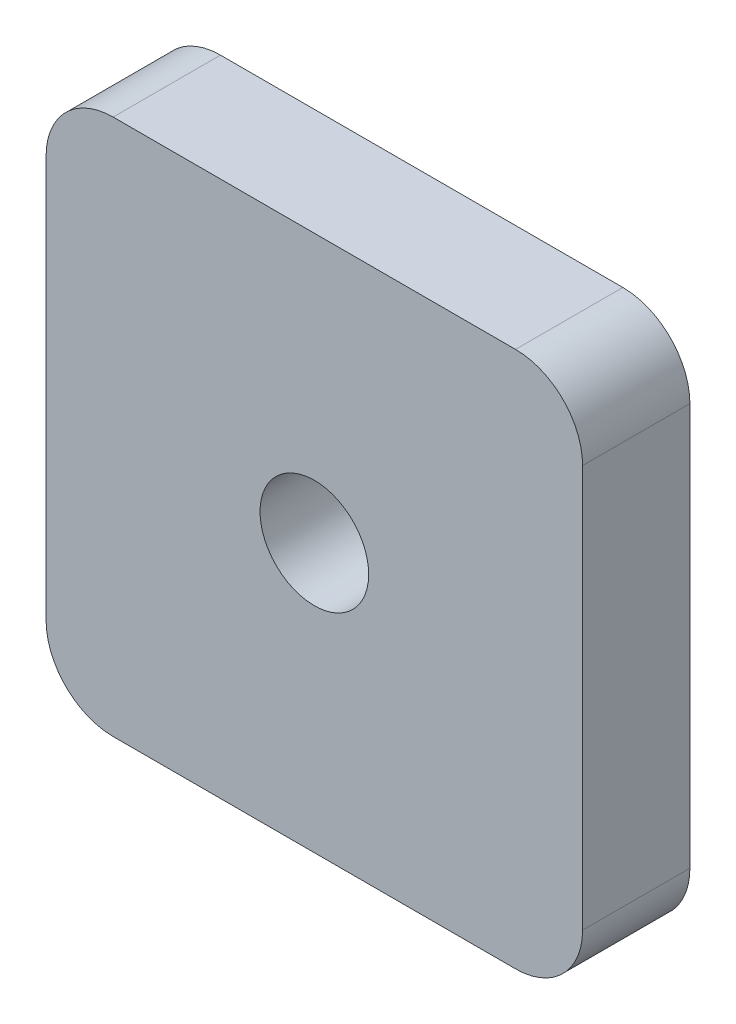
ISO-10303-21;
HEADER;
FILE_DESCRIPTION(('STEP AP214'),'2;1');
FILE_NAME('part.step','',(''),(''),'','','');
FILE_SCHEMA(('AUTOMOTIVE_DESIGN { 1 0 10303 214 1 1 1 1 }'));
ENDSEC;
DATA;
#1=APPLICATION_CONTEXT('core data for automotive mechanical design processes');
#2=APPLICATION_PROTOCOL_DEFINITION('international standard','automotive_design',2000,#1);
#3=PRODUCT_CONTEXT('',#1,'mechanical');
#4=PRODUCT('Part','Part','',(#3));
#5=PRODUCT_RELATED_PRODUCT_CATEGORY('part','',(#4));
#6=PRODUCT_DEFINITION_FORMATION('','',#4);
#7=PRODUCT_DEFINITION_CONTEXT('part definition',#1,'design');
#8=PRODUCT_DEFINITION('design','',#6,#7);
#9=PRODUCT_DEFINITION_SHAPE('','',#8);
#10=(LENGTH_UNIT() NAMED_UNIT(*) SI_UNIT(.MILLI.,.METRE.));
#11=(NAMED_UNIT(*) PLANE_ANGLE_UNIT() SI_UNIT($,.RADIAN.));
#12=(NAMED_UNIT(*) SI_UNIT($,.STERADIAN.) SOLID_ANGLE_UNIT());
#13=UNCERTAINTY_MEASURE_WITH_UNIT(LENGTH_MEASURE(1.E-05),#10,'distance_accuracy_value','');
#14=(GEOMETRIC_REPRESENTATION_CONTEXT(3) GLOBAL_UNCERTAINTY_ASSIGNED_CONTEXT((#13)) GLOBAL_UNIT_ASSIGNED_CONTEXT((#10,
#11,#12)) REPRESENTATION_CONTEXT('',''));
#15=CARTESIAN_POINT('',(0.,0.,0.));
#16=DIRECTION('',(0.,0.,1.));
#17=DIRECTION('',(1.,0.,0.));
#18=AXIS2_PLACEMENT_3D('',#15,#16,#17);
#19=CARTESIAN_POINT('',(0.,0.,8.));
#20=DIRECTION('',(0.,0.,1.));
#21=DIRECTION('',(1.,0.,0.));
#22=AXIS2_PLACEMENT_3D('',#19,#20,#21);
#23=PLANE('',#22);
#24=DIRECTION('',(1.,0.,0.));
#25=VECTOR('',#24,1.);
#26=CARTESIAN_POINT('',(-20.,-20.,8.));
#27=LINE('',#26,#25);
#28=CARTESIAN_POINT('',(-15.,-20.,8.));
#29=VERTEX_POINT('',#28);
#30=CARTESIAN_POINT('',(15.,-20.,8.));
#31=VERTEX_POINT('',#30);
#32=EDGE_CURVE('E135',#29,#31,#27,.T.);
#33=ORIENTED_EDGE('',*,*,#32,.T.);
#34=CARTESIAN_POINT('',(15.,-15.,8.));
#35=DIRECTION('',(0.,0.,1.));
#36=DIRECTION('',(1.,0.,0.));
#37=AXIS2_PLACEMENT_3D('',#34,#35,#36);
#38=CIRCLE('',#37,5.);
#39=CARTESIAN_POINT('',(20.,-15.,8.));
#40=VERTEX_POINT('',#39);
#41=EDGE_CURVE('E154',#31,#40,#38,.T.);
#42=ORIENTED_EDGE('',*,*,#41,.T.);
#43=DIRECTION('',(0.,1.,0.));
#44=VECTOR('',#43,1.);
#45=CARTESIAN_POINT('',(20.,20.,8.));
#46=LINE('',#45,#44);
#47=CARTESIAN_POINT('',(20.,15.,8.));
#48=VERTEX_POINT('',#47);
#49=EDGE_CURVE('E118',#40,#48,#46,.T.);
#50=ORIENTED_EDGE('',*,*,#49,.T.);
#51=CARTESIAN_POINT('',(15.,15.,8.));
#52=DIRECTION('',(0.,0.,1.));
#53=DIRECTION('',(1.,0.,0.));
#54=AXIS2_PLACEMENT_3D('',#51,#52,#53);
#55=CIRCLE('',#54,5.);
#56=CARTESIAN_POINT('',(15.,20.,8.));
#57=VERTEX_POINT('',#56);
#58=EDGE_CURVE('E149',#48,#57,#55,.T.);
#59=ORIENTED_EDGE('',*,*,#58,.T.);
#60=DIRECTION('',(-1.,0.,0.));
#61=VECTOR('',#60,1.);
#62=CARTESIAN_POINT('',(-20.,20.,8.));
#63=LINE('',#62,#61);
#64=CARTESIAN_POINT('',(-15.,20.,8.));
#65=VERTEX_POINT('',#64);
#66=EDGE_CURVE('E165',#57,#65,#63,.T.);
#67=ORIENTED_EDGE('',*,*,#66,.T.);
#68=CARTESIAN_POINT('',(-15.,15.,8.));
#69=DIRECTION('',(0.,0.,1.));
#70=DIRECTION('',(1.,0.,0.));
#71=AXIS2_PLACEMENT_3D('',#68,#69,#70);
#72=CIRCLE('',#71,5.);
#73=CARTESIAN_POINT('',(-20.,15.,8.));
#74=VERTEX_POINT('',#73);
#75=EDGE_CURVE('E54',#65,#74,#72,.T.);
#76=ORIENTED_EDGE('',*,*,#75,.T.);
#77=DIRECTION('',(0.,-1.,0.));
#78=VECTOR('',#77,1.);
#79=CARTESIAN_POINT('',(-20.,20.,8.));
#80=LINE('',#79,#78);
#81=CARTESIAN_POINT('',(-20.,-15.,8.));
#82=VERTEX_POINT('',#81);
#83=EDGE_CURVE('E173',#74,#82,#80,.T.);
#84=ORIENTED_EDGE('',*,*,#83,.T.);
#85=CARTESIAN_POINT('',(-15.,-15.,8.));
#86=DIRECTION('',(0.,0.,1.));
#87=DIRECTION('',(1.,0.,0.));
#88=AXIS2_PLACEMENT_3D('',#85,#86,#87);
#89=CIRCLE('',#88,5.);
#90=EDGE_CURVE('E152',#82,#29,#89,.T.);
#91=ORIENTED_EDGE('',*,*,#90,.T.);
#92=EDGE_LOOP('',(#33,#42,#50,#59,#67,#76,#84,#91));
#93=FACE_BOUND('',#92,.T.);
#94=CARTESIAN_POINT('',(0.,0.,8.));
#95=DIRECTION('',(0.,0.,1.));
#96=DIRECTION('',(1.,0.,0.));
#97=AXIS2_PLACEMENT_3D('',#94,#95,#96);
#98=CIRCLE('',#97,4.05);
#99=CARTESIAN_POINT('',(4.05000000000002,0.,8.));
#100=VERTEX_POINT('',#99);
#101=EDGE_CURVE('E126',#100,#100,#98,.T.);
#102=ORIENTED_EDGE('',*,*,#101,.F.);
#103=EDGE_LOOP('',(#102));
#104=FACE_BOUND('',#103,.T.);
#105=ADVANCED_FACE('F32',(#93,#104),#23,.T.);
#106=CARTESIAN_POINT('',(0.,0.,0.));
#107=DIRECTION('',(0.,0.,1.));
#108=DIRECTION('',(1.,0.,0.));
#109=AXIS2_PLACEMENT_3D('',#106,#107,#108);
#110=PLANE('',#109);
#111=DIRECTION('',(0.,1.,0.));
#112=VECTOR('',#111,1.);
#113=CARTESIAN_POINT('',(20.,20.,0.));
#114=LINE('',#113,#112);
#115=CARTESIAN_POINT('',(20.,-15.,0.));
#116=VERTEX_POINT('',#115);
#117=CARTESIAN_POINT('',(20.,15.,0.));
#118=VERTEX_POINT('',#117);
#119=EDGE_CURVE('E115',#116,#118,#114,.T.);
#120=ORIENTED_EDGE('',*,*,#119,.F.);
#121=CARTESIAN_POINT('',(15.,-15.,0.));
#122=DIRECTION('',(0.,0.,1.));
#123=DIRECTION('',(1.,0.,0.));
#124=AXIS2_PLACEMENT_3D('',#121,#122,#123);
#125=CIRCLE('',#124,5.);
#126=CARTESIAN_POINT('',(15.,-20.,0.));
#127=VERTEX_POINT('',#126);
#128=EDGE_CURVE('E98',#116,#127,#125,.F.);
#129=ORIENTED_EDGE('',*,*,#128,.T.);
#130=DIRECTION('',(1.,0.,0.));
#131=VECTOR('',#130,1.);
#132=CARTESIAN_POINT('',(-20.,-20.,0.));
#133=LINE('',#132,#131);
#134=CARTESIAN_POINT('',(-15.,-20.,0.));
#135=VERTEX_POINT('',#134);
#136=EDGE_CURVE('E139',#135,#127,#133,.T.);
#137=ORIENTED_EDGE('',*,*,#136,.F.);
#138=CARTESIAN_POINT('',(-15.,-15.,0.));
#139=DIRECTION('',(0.,0.,1.));
#140=DIRECTION('',(1.,0.,0.));
#141=AXIS2_PLACEMENT_3D('',#138,#139,#140);
#142=CIRCLE('',#141,5.);
#143=CARTESIAN_POINT('',(-20.,-15.,0.));
#144=VERTEX_POINT('',#143);
#145=EDGE_CURVE('E109',#135,#144,#142,.F.);
#146=ORIENTED_EDGE('',*,*,#145,.T.);
#147=DIRECTION('',(0.,-1.,0.));
#148=VECTOR('',#147,1.);
#149=CARTESIAN_POINT('',(-20.,20.,0.));
#150=LINE('',#149,#148);
#151=CARTESIAN_POINT('',(-20.,15.,0.));
#152=VERTEX_POINT('',#151);
#153=EDGE_CURVE('E129',#152,#144,#150,.T.);
#154=ORIENTED_EDGE('',*,*,#153,.F.);
#155=CARTESIAN_POINT('',(-15.,15.,0.));
#156=DIRECTION('',(0.,0.,1.));
#157=DIRECTION('',(1.,0.,0.));
#158=AXIS2_PLACEMENT_3D('',#155,#156,#157);
#159=CIRCLE('',#158,5.);
#160=CARTESIAN_POINT('',(-15.,20.,0.));
#161=VERTEX_POINT('',#160);
#162=EDGE_CURVE('E143',#152,#161,#159,.F.);
#163=ORIENTED_EDGE('',*,*,#162,.T.);
#164=DIRECTION('',(-1.,0.,0.));
#165=VECTOR('',#164,1.);
#166=CARTESIAN_POINT('',(-20.,20.,0.));
#167=LINE('',#166,#165);
#168=CARTESIAN_POINT('',(15.,20.,0.));
#169=VERTEX_POINT('',#168);
#170=EDGE_CURVE('E125',#169,#161,#167,.T.);
#171=ORIENTED_EDGE('',*,*,#170,.F.);
#172=CARTESIAN_POINT('',(15.,15.,0.));
#173=DIRECTION('',(0.,0.,1.));
#174=DIRECTION('',(1.,0.,0.));
#175=AXIS2_PLACEMENT_3D('',#172,#173,#174);
#176=CIRCLE('',#175,5.);
#177=EDGE_CURVE('E119',#169,#118,#176,.F.);
#178=ORIENTED_EDGE('',*,*,#177,.T.);
#179=EDGE_LOOP('',(#120,#129,#137,#146,#154,#163,#171,#178));
#180=FACE_BOUND('',#179,.T.);
#181=CARTESIAN_POINT('',(0.,0.,0.));
#182=DIRECTION('',(0.,0.,1.));
#183=DIRECTION('',(1.,0.,0.));
#184=AXIS2_PLACEMENT_3D('',#181,#182,#183);
#185=CIRCLE('',#184,4.05);
#186=CARTESIAN_POINT('',(4.05000000000002,0.,0.));
#187=VERTEX_POINT('',#186);
#188=EDGE_CURVE('E132',#187,#187,#185,.T.);
#189=ORIENTED_EDGE('',*,*,#188,.T.);
#190=EDGE_LOOP('',(#189));
#191=FACE_BOUND('',#190,.T.);
#192=ADVANCED_FACE('F122',(#180,#191),#110,.F.);
#193=CARTESIAN_POINT('',(20.,20.,8.));
#194=DIRECTION('',(-1.,0.,0.));
#195=DIRECTION('',(0.,-1.,0.));
#196=AXIS2_PLACEMENT_3D('',#193,#194,#195);
#197=PLANE('',#196);
#198=ORIENTED_EDGE('',*,*,#49,.F.);
#199=DIRECTION('',(0.,0.,-1.));
#200=VECTOR('',#199,1.);
#201=CARTESIAN_POINT('',(20.,-15.,8.));
#202=LINE('',#201,#200);
#203=EDGE_CURVE('E102',#40,#116,#202,.T.);
#204=ORIENTED_EDGE('',*,*,#203,.T.);
#205=ORIENTED_EDGE('',*,*,#119,.T.);
#206=DIRECTION('',(0.,0.,-1.));
#207=VECTOR('',#206,1.);
#208=CARTESIAN_POINT('',(20.,15.,8.));
#209=LINE('',#208,#207);
#210=EDGE_CURVE('E120',#118,#48,#209,.F.);
#211=ORIENTED_EDGE('',*,*,#210,.T.);
#212=EDGE_LOOP('',(#198,#204,#205,#211));
#213=FACE_BOUND('',#212,.T.);
#214=ADVANCED_FACE('F114',(#213),#197,.F.);
#215=CARTESIAN_POINT('',(-20.,20.,8.));
#216=DIRECTION('',(0.,-1.,0.));
#217=DIRECTION('',(0.,0.,-1.));
#218=AXIS2_PLACEMENT_3D('',#215,#216,#217);
#219=PLANE('',#218);
#220=ORIENTED_EDGE('',*,*,#170,.T.);
#221=DIRECTION('',(0.,0.,-1.));
#222=VECTOR('',#221,1.);
#223=CARTESIAN_POINT('',(-15.,20.,8.));
#224=LINE('',#223,#222);
#225=EDGE_CURVE('E11',#161,#65,#224,.F.);
#226=ORIENTED_EDGE('',*,*,#225,.T.);
#227=ORIENTED_EDGE('',*,*,#66,.F.);
#228=DIRECTION('',(0.,0.,-1.));
#229=VECTOR('',#228,1.);
#230=CARTESIAN_POINT('',(15.,20.,8.));
#231=LINE('',#230,#229);
#232=EDGE_CURVE('E40',#57,#169,#231,.T.);
#233=ORIENTED_EDGE('',*,*,#232,.T.);
#234=EDGE_LOOP('',(#220,#226,#227,#233));
#235=FACE_BOUND('',#234,.T.);
#236=ADVANCED_FACE('F163',(#235),#219,.F.);
#237=CARTESIAN_POINT('',(-20.,20.,8.));
#238=DIRECTION('',(1.,0.,0.));
#239=DIRECTION('',(0.,1.,0.));
#240=AXIS2_PLACEMENT_3D('',#237,#238,#239);
#241=PLANE('',#240);
#242=ORIENTED_EDGE('',*,*,#153,.T.);
#243=DIRECTION('',(0.,0.,-1.));
#244=VECTOR('',#243,1.);
#245=CARTESIAN_POINT('',(-20.,-15.,8.));
#246=LINE('',#245,#244);
#247=EDGE_CURVE('E47',#144,#82,#246,.F.);
#248=ORIENTED_EDGE('',*,*,#247,.T.);
#249=ORIENTED_EDGE('',*,*,#83,.F.);
#250=DIRECTION('',(0.,0.,-1.));
#251=VECTOR('',#250,1.);
#252=CARTESIAN_POINT('',(-20.,15.,8.));
#253=LINE('',#252,#251);
#254=EDGE_CURVE('E156',#74,#152,#253,.T.);
#255=ORIENTED_EDGE('',*,*,#254,.T.);
#256=EDGE_LOOP('',(#242,#248,#249,#255));
#257=FACE_BOUND('',#256,.T.);
#258=ADVANCED_FACE('F172',(#257),#241,.F.);
#259=CARTESIAN_POINT('',(-20.,-20.,8.));
#260=DIRECTION('',(0.,1.,0.));
#261=DIRECTION('',(-1.,0.,0.));
#262=AXIS2_PLACEMENT_3D('',#259,#260,#261);
#263=PLANE('',#262);
#264=ORIENTED_EDGE('',*,*,#136,.T.);
#265=DIRECTION('',(0.,0.,-1.));
#266=VECTOR('',#265,1.);
#267=CARTESIAN_POINT('',(15.,-20.,8.));
#268=LINE('',#267,#266);
#269=EDGE_CURVE('E103',#127,#31,#268,.F.);
#270=ORIENTED_EDGE('',*,*,#269,.T.);
#271=ORIENTED_EDGE('',*,*,#32,.F.);
#272=DIRECTION('',(0.,0.,-1.));
#273=VECTOR('',#272,1.);
#274=CARTESIAN_POINT('',(-15.,-20.,8.));
#275=LINE('',#274,#273);
#276=EDGE_CURVE('E108',#29,#135,#275,.T.);
#277=ORIENTED_EDGE('',*,*,#276,.T.);
#278=EDGE_LOOP('',(#264,#270,#271,#277));
#279=FACE_BOUND('',#278,.T.);
#280=ADVANCED_FACE('F184',(#279),#263,.F.);
#281=CARTESIAN_POINT('',(0.,0.,8.));
#282=DIRECTION('',(0.,0.,-1.));
#283=DIRECTION('',(-1.,0.,0.));
#284=AXIS2_PLACEMENT_3D('',#281,#282,#283);
#285=CYLINDRICAL_SURFACE('',#284,4.05);
#286=ORIENTED_EDGE('',*,*,#101,.T.);
#287=EDGE_LOOP('',(#286));
#288=FACE_BOUND('',#287,.T.);
#289=ORIENTED_EDGE('',*,*,#188,.F.);
#290=EDGE_LOOP('',(#289));
#291=FACE_BOUND('',#290,.T.);
#292=ADVANCED_FACE('F182',(#288,#291),#285,.F.);
#293=CARTESIAN_POINT('',(15.,-15.,8.));
#294=DIRECTION('',(0.,0.,-1.));
#295=DIRECTION('',(-1.,0.,0.));
#296=AXIS2_PLACEMENT_3D('',#293,#294,#295);
#297=CYLINDRICAL_SURFACE('',#296,5.);
#298=ORIENTED_EDGE('',*,*,#41,.F.);
#299=ORIENTED_EDGE('',*,*,#269,.F.);
#300=ORIENTED_EDGE('',*,*,#128,.F.);
#301=ORIENTED_EDGE('',*,*,#203,.F.);
#302=EDGE_LOOP('',(#298,#299,#300,#301));
#303=FACE_BOUND('',#302,.T.);
#304=ADVANCED_FACE('F101',(#303),#297,.T.);
#305=CARTESIAN_POINT('',(-15.,-15.,8.));
#306=DIRECTION('',(0.,0.,-1.));
#307=DIRECTION('',(-1.,0.,0.));
#308=AXIS2_PLACEMENT_3D('',#305,#306,#307);
#309=CYLINDRICAL_SURFACE('',#308,5.);
#310=ORIENTED_EDGE('',*,*,#90,.F.);
#311=ORIENTED_EDGE('',*,*,#247,.F.);
#312=ORIENTED_EDGE('',*,*,#145,.F.);
#313=ORIENTED_EDGE('',*,*,#276,.F.);
#314=EDGE_LOOP('',(#310,#311,#312,#313));
#315=FACE_BOUND('',#314,.T.);
#316=ADVANCED_FACE('F191',(#315),#309,.T.);
#317=CARTESIAN_POINT('',(-15.,15.,8.));
#318=DIRECTION('',(0.,0.,-1.));
#319=DIRECTION('',(-1.,0.,0.));
#320=AXIS2_PLACEMENT_3D('',#317,#318,#319);
#321=CYLINDRICAL_SURFACE('',#320,5.);
#322=ORIENTED_EDGE('',*,*,#75,.F.);
#323=ORIENTED_EDGE('',*,*,#225,.F.);
#324=ORIENTED_EDGE('',*,*,#162,.F.);
#325=ORIENTED_EDGE('',*,*,#254,.F.);
#326=EDGE_LOOP('',(#322,#323,#324,#325));
#327=FACE_BOUND('',#326,.T.);
#328=ADVANCED_FACE('F171',(#327),#321,.T.);
#329=CARTESIAN_POINT('',(15.,15.,8.));
#330=DIRECTION('',(0.,0.,-1.));
#331=DIRECTION('',(-1.,0.,0.));
#332=AXIS2_PLACEMENT_3D('',#329,#330,#331);
#333=CYLINDRICAL_SURFACE('',#332,5.);
#334=ORIENTED_EDGE('',*,*,#58,.F.);
#335=ORIENTED_EDGE('',*,*,#210,.F.);
#336=ORIENTED_EDGE('',*,*,#177,.F.);
#337=ORIENTED_EDGE('',*,*,#232,.F.);
#338=EDGE_LOOP('',(#334,#335,#336,#337));
#339=FACE_BOUND('',#338,.T.);
#340=ADVANCED_FACE('F34',(#339),#333,.T.);
#341=CLOSED_SHELL('',(#105,#192,#214,#236,#258,#280,#292,#304,#316,#328,#340));
#342=MANIFOLD_SOLID_BREP('B2',#341);
#343=ADVANCED_BREP_SHAPE_REPRESENTATION('',(#18,#342),#14);
#344=SHAPE_DEFINITION_REPRESENTATION(#9,#343);
ENDSEC;
END-ISO-10303-21;
